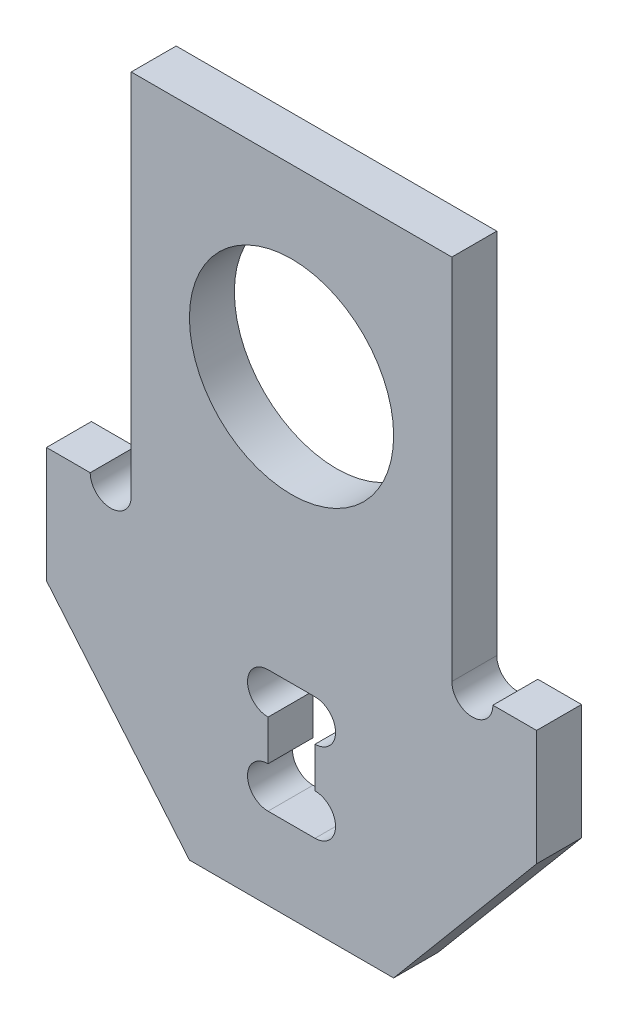
ISO-10303-21;
HEADER;
FILE_DESCRIPTION(('STEP AP214'),'2;1');
FILE_NAME('part.step','',(''),(''),'','','');
FILE_SCHEMA(('AUTOMOTIVE_DESIGN { 1 0 10303 214 1 1 1 1 }'));
ENDSEC;
DATA;
#1=APPLICATION_CONTEXT('core data for automotive mechanical design processes');
#2=APPLICATION_PROTOCOL_DEFINITION('international standard','automotive_design',2000,#1);
#3=PRODUCT_CONTEXT('',#1,'mechanical');
#4=PRODUCT('Part','Part','',(#3));
#5=PRODUCT_RELATED_PRODUCT_CATEGORY('part','',(#4));
#6=PRODUCT_DEFINITION_FORMATION('','',#4);
#7=PRODUCT_DEFINITION_CONTEXT('part definition',#1,'design');
#8=PRODUCT_DEFINITION('design','',#6,#7);
#9=PRODUCT_DEFINITION_SHAPE('','',#8);
#10=(LENGTH_UNIT() NAMED_UNIT(*) SI_UNIT(.MILLI.,.METRE.));
#11=(NAMED_UNIT(*) PLANE_ANGLE_UNIT() SI_UNIT($,.RADIAN.));
#12=(NAMED_UNIT(*) SI_UNIT($,.STERADIAN.) SOLID_ANGLE_UNIT());
#13=UNCERTAINTY_MEASURE_WITH_UNIT(LENGTH_MEASURE(1.E-05),#10,'distance_accuracy_value','');
#14=(GEOMETRIC_REPRESENTATION_CONTEXT(3) GLOBAL_UNCERTAINTY_ASSIGNED_CONTEXT((#13)) GLOBAL_UNIT_ASSIGNED_CONTEXT((#10,
#11,#12)) REPRESENTATION_CONTEXT('',''));
#15=CARTESIAN_POINT('',(0.,0.,0.));
#16=DIRECTION('',(0.,0.,1.));
#17=DIRECTION('',(1.,0.,0.));
#18=AXIS2_PLACEMENT_3D('',#15,#16,#17);
#19=CARTESIAN_POINT('',(-8.855,-9.,2.2));
#20=DIRECTION('',(0.,0.,-1.));
#21=DIRECTION('',(-1.,0.,0.));
#22=AXIS2_PLACEMENT_3D('',#19,#20,#21);
#23=CYLINDRICAL_SURFACE('',#22,1.005);
#24=CARTESIAN_POINT('',(-8.855,-9.,0.));
#25=DIRECTION('',(0.,0.,1.));
#26=DIRECTION('',(1.,0.,0.));
#27=AXIS2_PLACEMENT_3D('',#24,#25,#26);
#28=CIRCLE('',#27,1.005);
#29=CARTESIAN_POINT('',(-9.86,-9.,0.));
#30=VERTEX_POINT('',#29);
#31=CARTESIAN_POINT('',(-7.85,-9.,0.));
#32=VERTEX_POINT('',#31);
#33=EDGE_CURVE('E276',#30,#32,#28,.T.);
#34=ORIENTED_EDGE('',*,*,#33,.F.);
#35=DIRECTION('',(0.,0.,-1.));
#36=VECTOR('',#35,1.);
#37=CARTESIAN_POINT('',(-9.86,-9.,2.2));
#38=LINE('',#37,#36);
#39=CARTESIAN_POINT('',(-9.86,-9.,2.2));
#40=VERTEX_POINT('',#39);
#41=EDGE_CURVE('E11',#40,#30,#38,.T.);
#42=ORIENTED_EDGE('',*,*,#41,.F.);
#43=CARTESIAN_POINT('',(-8.855,-9.,2.2));
#44=DIRECTION('',(0.,0.,1.));
#45=DIRECTION('',(1.,0.,0.));
#46=AXIS2_PLACEMENT_3D('',#43,#44,#45);
#47=CIRCLE('',#46,1.005);
#48=CARTESIAN_POINT('',(-7.85,-9.,2.2));
#49=VERTEX_POINT('',#48);
#50=EDGE_CURVE('E326',#40,#49,#47,.T.);
#51=ORIENTED_EDGE('',*,*,#50,.T.);
#52=DIRECTION('',(0.,0.,-1.));
#53=VECTOR('',#52,1.);
#54=CARTESIAN_POINT('',(-7.85,-9.,2.2));
#55=LINE('',#54,#53);
#56=EDGE_CURVE('E55',#49,#32,#55,.T.);
#57=ORIENTED_EDGE('',*,*,#56,.T.);
#58=EDGE_LOOP('',(#34,#42,#51,#57));
#59=FACE_BOUND('',#58,.T.);
#60=ADVANCED_FACE('F36',(#59),#23,.F.);
#61=CARTESIAN_POINT('',(0.,-9.,2.2));
#62=DIRECTION('',(0.,-1.,0.));
#63=DIRECTION('',(0.,0.,-1.));
#64=AXIS2_PLACEMENT_3D('',#61,#62,#63);
#65=PLANE('',#64);
#66=DIRECTION('',(-1.,0.,0.));
#67=VECTOR('',#66,1.);
#68=CARTESIAN_POINT('',(0.,-9.,0.));
#69=LINE('',#68,#67);
#70=CARTESIAN_POINT('',(-12.,-9.,0.));
#71=VERTEX_POINT('',#70);
#72=EDGE_CURVE('E273',#30,#71,#69,.T.);
#73=ORIENTED_EDGE('',*,*,#72,.T.);
#74=DIRECTION('',(0.,0.,-1.));
#75=VECTOR('',#74,1.);
#76=CARTESIAN_POINT('',(-12.,-9.,2.2));
#77=LINE('',#76,#75);
#78=CARTESIAN_POINT('',(-12.,-9.,2.2));
#79=VERTEX_POINT('',#78);
#80=EDGE_CURVE('E46',#79,#71,#77,.T.);
#81=ORIENTED_EDGE('',*,*,#80,.F.);
#82=DIRECTION('',(-1.,0.,0.));
#83=VECTOR('',#82,1.);
#84=CARTESIAN_POINT('',(0.,-9.,2.2));
#85=LINE('',#84,#83);
#86=EDGE_CURVE('E323',#40,#79,#85,.T.);
#87=ORIENTED_EDGE('',*,*,#86,.F.);
#88=ORIENTED_EDGE('',*,*,#41,.T.);
#89=EDGE_LOOP('',(#73,#81,#87,#88));
#90=FACE_BOUND('',#89,.T.);
#91=ADVANCED_FACE('F395',(#90),#65,.F.);
#92=CARTESIAN_POINT('',(-12.,0.,2.2));
#93=DIRECTION('',(1.,0.,0.));
#94=DIRECTION('',(0.,0.,-1.));
#95=AXIS2_PLACEMENT_3D('',#92,#93,#94);
#96=PLANE('',#95);
#97=DIRECTION('',(0.,-1.,0.));
#98=VECTOR('',#97,1.);
#99=CARTESIAN_POINT('',(-12.,0.,0.));
#100=LINE('',#99,#98);
#101=CARTESIAN_POINT('',(-12.,-14.6577248518405,0.));
#102=VERTEX_POINT('',#101);
#103=EDGE_CURVE('E270',#71,#102,#100,.T.);
#104=ORIENTED_EDGE('',*,*,#103,.T.);
#105=DIRECTION('',(0.,0.,-1.));
#106=VECTOR('',#105,1.);
#107=CARTESIAN_POINT('',(-12.,-14.6577248518405,2.2));
#108=LINE('',#107,#106);
#109=CARTESIAN_POINT('',(-12.,-14.6577248518405,2.2));
#110=VERTEX_POINT('',#109);
#111=EDGE_CURVE('E220',#110,#102,#108,.T.);
#112=ORIENTED_EDGE('',*,*,#111,.F.);
#113=DIRECTION('',(0.,-1.,0.));
#114=VECTOR('',#113,1.);
#115=CARTESIAN_POINT('',(-12.,0.,2.2));
#116=LINE('',#115,#114);
#117=EDGE_CURVE('E320',#79,#110,#116,.T.);
#118=ORIENTED_EDGE('',*,*,#117,.F.);
#119=ORIENTED_EDGE('',*,*,#80,.T.);
#120=EDGE_LOOP('',(#104,#112,#118,#119));
#121=FACE_BOUND('',#120,.T.);
#122=ADVANCED_FACE('F400',(#121),#96,.F.);
#123=CARTESIAN_POINT('',(-14.2594096038077,-11.9650653393608,2.2));
#124=DIRECTION('',(0.766044443118979,0.642787609686538,0.));
#125=DIRECTION('',(-0.642787609686538,0.766044443118979,0.));
#126=AXIS2_PLACEMENT_3D('',#123,#124,#125);
#127=PLANE('',#126);
#128=DIRECTION('',(0.642787609686538,-0.766044443118979,0.));
#129=VECTOR('',#128,1.);
#130=CARTESIAN_POINT('',(-14.2594096038077,-11.9650653393608,0.));
#131=LINE('',#130,#129);
#132=CARTESIAN_POINT('',(-4.99999999999999,-23.,0.));
#133=VERTEX_POINT('',#132);
#134=EDGE_CURVE('E267',#102,#133,#131,.T.);
#135=ORIENTED_EDGE('',*,*,#134,.T.);
#136=DIRECTION('',(0.,0.,-1.));
#137=VECTOR('',#136,1.);
#138=CARTESIAN_POINT('',(-4.99999999999999,-23.,2.2));
#139=LINE('',#138,#137);
#140=CARTESIAN_POINT('',(-4.99999999999999,-23.,2.2));
#141=VERTEX_POINT('',#140);
#142=EDGE_CURVE('E217',#141,#133,#139,.T.);
#143=ORIENTED_EDGE('',*,*,#142,.F.);
#144=DIRECTION('',(0.642787609686538,-0.766044443118979,0.));
#145=VECTOR('',#144,1.);
#146=CARTESIAN_POINT('',(-14.2594096038077,-11.9650653393608,2.2));
#147=LINE('',#146,#145);
#148=EDGE_CURVE('E317',#110,#141,#147,.T.);
#149=ORIENTED_EDGE('',*,*,#148,.F.);
#150=ORIENTED_EDGE('',*,*,#111,.T.);
#151=EDGE_LOOP('',(#135,#143,#149,#150));
#152=FACE_BOUND('',#151,.T.);
#153=ADVANCED_FACE('F544',(#152),#127,.F.);
#154=CARTESIAN_POINT('',(0.,-23.,2.2));
#155=DIRECTION('',(0.,1.,0.));
#156=DIRECTION('',(0.,0.,1.));
#157=AXIS2_PLACEMENT_3D('',#154,#155,#156);
#158=PLANE('',#157);
#159=DIRECTION('',(1.,0.,0.));
#160=VECTOR('',#159,1.);
#161=CARTESIAN_POINT('',(0.,-23.,0.));
#162=LINE('',#161,#160);
#163=CARTESIAN_POINT('',(5.,-23.,0.));
#164=VERTEX_POINT('',#163);
#165=EDGE_CURVE('E264',#133,#164,#162,.T.);
#166=ORIENTED_EDGE('',*,*,#165,.T.);
#167=DIRECTION('',(0.,0.,-1.));
#168=VECTOR('',#167,1.);
#169=CARTESIAN_POINT('',(5.,-23.,2.2));
#170=LINE('',#169,#168);
#171=CARTESIAN_POINT('',(5.,-23.,2.2));
#172=VERTEX_POINT('',#171);
#173=EDGE_CURVE('E215',#172,#164,#170,.T.);
#174=ORIENTED_EDGE('',*,*,#173,.F.);
#175=DIRECTION('',(1.,0.,0.));
#176=VECTOR('',#175,1.);
#177=CARTESIAN_POINT('',(0.,-23.,2.2));
#178=LINE('',#177,#176);
#179=EDGE_CURVE('E315',#141,#172,#178,.T.);
#180=ORIENTED_EDGE('',*,*,#179,.F.);
#181=ORIENTED_EDGE('',*,*,#142,.T.);
#182=EDGE_LOOP('',(#166,#174,#180,#181));
#183=FACE_BOUND('',#182,.T.);
#184=ADVANCED_FACE('F535',(#183),#158,.F.);
#185=CARTESIAN_POINT('',(14.2594096038077,-11.9650653393608,2.2));
#186=DIRECTION('',(0.766044443118979,-0.642787609686538,0.));
#187=DIRECTION('',(0.642787609686538,0.766044443118979,0.));
#188=AXIS2_PLACEMENT_3D('',#185,#186,#187);
#189=PLANE('',#188);
#190=DIRECTION('',(-0.642787609686538,-0.766044443118979,0.));
#191=VECTOR('',#190,1.);
#192=CARTESIAN_POINT('',(14.2594096038077,-11.9650653393608,0.));
#193=LINE('',#192,#191);
#194=CARTESIAN_POINT('',(12.,-14.6577248518405,0.));
#195=VERTEX_POINT('',#194);
#196=EDGE_CURVE('E261',#195,#164,#193,.T.);
#197=ORIENTED_EDGE('',*,*,#196,.F.);
#198=DIRECTION('',(0.,0.,-1.));
#199=VECTOR('',#198,1.);
#200=CARTESIAN_POINT('',(12.,-14.6577248518405,2.2));
#201=LINE('',#200,#199);
#202=CARTESIAN_POINT('',(12.,-14.6577248518405,2.2));
#203=VERTEX_POINT('',#202);
#204=EDGE_CURVE('E213',#203,#195,#201,.T.);
#205=ORIENTED_EDGE('',*,*,#204,.F.);
#206=DIRECTION('',(-0.642787609686538,-0.766044443118979,0.));
#207=VECTOR('',#206,1.);
#208=CARTESIAN_POINT('',(14.2594096038077,-11.9650653393608,2.2));
#209=LINE('',#208,#207);
#210=EDGE_CURVE('E312',#203,#172,#209,.T.);
#211=ORIENTED_EDGE('',*,*,#210,.T.);
#212=ORIENTED_EDGE('',*,*,#173,.T.);
#213=EDGE_LOOP('',(#197,#205,#211,#212));
#214=FACE_BOUND('',#213,.T.);
#215=ADVANCED_FACE('F526',(#214),#189,.T.);
#216=CARTESIAN_POINT('',(12.,0.,2.2));
#217=DIRECTION('',(1.,0.,0.));
#218=DIRECTION('',(0.,0.,-1.));
#219=AXIS2_PLACEMENT_3D('',#216,#217,#218);
#220=PLANE('',#219);
#221=DIRECTION('',(0.,-1.,0.));
#222=VECTOR('',#221,1.);
#223=CARTESIAN_POINT('',(12.,0.,0.));
#224=LINE('',#223,#222);
#225=CARTESIAN_POINT('',(12.,-9.,0.));
#226=VERTEX_POINT('',#225);
#227=EDGE_CURVE('E258',#226,#195,#224,.T.);
#228=ORIENTED_EDGE('',*,*,#227,.F.);
#229=DIRECTION('',(0.,0.,-1.));
#230=VECTOR('',#229,1.);
#231=CARTESIAN_POINT('',(12.,-9.,2.2));
#232=LINE('',#231,#230);
#233=CARTESIAN_POINT('',(12.,-9.,2.2));
#234=VERTEX_POINT('',#233);
#235=EDGE_CURVE('E211',#234,#226,#232,.T.);
#236=ORIENTED_EDGE('',*,*,#235,.F.);
#237=DIRECTION('',(0.,-1.,0.));
#238=VECTOR('',#237,1.);
#239=CARTESIAN_POINT('',(12.,0.,2.2));
#240=LINE('',#239,#238);
#241=EDGE_CURVE('E309',#234,#203,#240,.T.);
#242=ORIENTED_EDGE('',*,*,#241,.T.);
#243=ORIENTED_EDGE('',*,*,#204,.T.);
#244=EDGE_LOOP('',(#228,#236,#242,#243));
#245=FACE_BOUND('',#244,.T.);
#246=ADVANCED_FACE('F517',(#245),#220,.T.);
#247=CARTESIAN_POINT('',(0.,-9.,2.2));
#248=DIRECTION('',(0.,1.,0.));
#249=DIRECTION('',(-1.,0.,0.));
#250=AXIS2_PLACEMENT_3D('',#247,#248,#249);
#251=PLANE('',#250);
#252=DIRECTION('',(1.,0.,0.));
#253=VECTOR('',#252,1.);
#254=CARTESIAN_POINT('',(0.,-9.,0.));
#255=LINE('',#254,#253);
#256=CARTESIAN_POINT('',(9.86,-9.,0.));
#257=VERTEX_POINT('',#256);
#258=EDGE_CURVE('E255',#257,#226,#255,.T.);
#259=ORIENTED_EDGE('',*,*,#258,.F.);
#260=DIRECTION('',(0.,0.,-1.));
#261=VECTOR('',#260,1.);
#262=CARTESIAN_POINT('',(9.86,-9.,2.2));
#263=LINE('',#262,#261);
#264=CARTESIAN_POINT('',(9.86,-9.,2.2));
#265=VERTEX_POINT('',#264);
#266=EDGE_CURVE('E205',#265,#257,#263,.T.);
#267=ORIENTED_EDGE('',*,*,#266,.F.);
#268=DIRECTION('',(1.,0.,0.));
#269=VECTOR('',#268,1.);
#270=CARTESIAN_POINT('',(0.,-9.,2.2));
#271=LINE('',#270,#269);
#272=EDGE_CURVE('E306',#265,#234,#271,.T.);
#273=ORIENTED_EDGE('',*,*,#272,.T.);
#274=ORIENTED_EDGE('',*,*,#235,.T.);
#275=EDGE_LOOP('',(#259,#267,#273,#274));
#276=FACE_BOUND('',#275,.T.);
#277=ADVANCED_FACE('F508',(#276),#251,.T.);
#278=CARTESIAN_POINT('',(8.85500000000001,-9.,2.2));
#279=DIRECTION('',(0.,0.,-1.));
#280=DIRECTION('',(-1.,0.,0.));
#281=AXIS2_PLACEMENT_3D('',#278,#279,#280);
#282=CYLINDRICAL_SURFACE('',#281,1.005);
#283=CARTESIAN_POINT('',(8.85500000000001,-9.,0.));
#284=DIRECTION('',(0.,0.,1.));
#285=DIRECTION('',(1.,0.,0.));
#286=AXIS2_PLACEMENT_3D('',#283,#284,#285);
#287=CIRCLE('',#286,1.005);
#288=CARTESIAN_POINT('',(7.85,-9.,0.));
#289=VERTEX_POINT('',#288);
#290=EDGE_CURVE('E252',#289,#257,#287,.T.);
#291=ORIENTED_EDGE('',*,*,#290,.F.);
#292=DIRECTION('',(0.,0.,-1.));
#293=VECTOR('',#292,1.);
#294=CARTESIAN_POINT('',(7.85,-9.,2.2));
#295=LINE('',#294,#293);
#296=CARTESIAN_POINT('',(7.85,-9.,2.2));
#297=VERTEX_POINT('',#296);
#298=EDGE_CURVE('E203',#297,#289,#295,.T.);
#299=ORIENTED_EDGE('',*,*,#298,.F.);
#300=CARTESIAN_POINT('',(8.85500000000001,-9.,2.2));
#301=DIRECTION('',(0.,0.,1.));
#302=DIRECTION('',(1.,0.,0.));
#303=AXIS2_PLACEMENT_3D('',#300,#301,#302);
#304=CIRCLE('',#303,1.005);
#305=EDGE_CURVE('E197',#297,#265,#304,.T.);
#306=ORIENTED_EDGE('',*,*,#305,.T.);
#307=ORIENTED_EDGE('',*,*,#266,.T.);
#308=EDGE_LOOP('',(#291,#299,#306,#307));
#309=FACE_BOUND('',#308,.T.);
#310=ADVANCED_FACE('F500',(#309),#282,.F.);
#311=CARTESIAN_POINT('',(7.85,0.,2.2));
#312=DIRECTION('',(-1.,0.,0.));
#313=DIRECTION('',(0.,-1.,0.));
#314=AXIS2_PLACEMENT_3D('',#311,#312,#313);
#315=PLANE('',#314);
#316=DIRECTION('',(0.,1.,0.));
#317=VECTOR('',#316,1.);
#318=CARTESIAN_POINT('',(7.85,0.,0.));
#319=LINE('',#318,#317);
#320=CARTESIAN_POINT('',(7.85,9.,0.));
#321=VERTEX_POINT('',#320);
#322=EDGE_CURVE('E202',#289,#321,#319,.T.);
#323=ORIENTED_EDGE('',*,*,#322,.T.);
#324=DIRECTION('',(0.,0.,-1.));
#325=VECTOR('',#324,1.);
#326=CARTESIAN_POINT('',(7.85,9.,2.2));
#327=LINE('',#326,#325);
#328=CARTESIAN_POINT('',(7.85,9.,2.2));
#329=VERTEX_POINT('',#328);
#330=EDGE_CURVE('E184',#329,#321,#327,.T.);
#331=ORIENTED_EDGE('',*,*,#330,.F.);
#332=DIRECTION('',(0.,1.,0.));
#333=VECTOR('',#332,1.);
#334=CARTESIAN_POINT('',(7.85,0.,2.2));
#335=LINE('',#334,#333);
#336=EDGE_CURVE('E189',#297,#329,#335,.T.);
#337=ORIENTED_EDGE('',*,*,#336,.F.);
#338=ORIENTED_EDGE('',*,*,#298,.T.);
#339=EDGE_LOOP('',(#323,#331,#337,#338));
#340=FACE_BOUND('',#339,.T.);
#341=ADVANCED_FACE('F200',(#340),#315,.F.);
#342=CARTESIAN_POINT('',(0.,9.,2.2));
#343=DIRECTION('',(0.,-1.,0.));
#344=DIRECTION('',(1.,0.,0.));
#345=AXIS2_PLACEMENT_3D('',#342,#343,#344);
#346=PLANE('',#345);
#347=DIRECTION('',(-1.,0.,0.));
#348=VECTOR('',#347,1.);
#349=CARTESIAN_POINT('',(0.,9.,0.));
#350=LINE('',#349,#348);
#351=CARTESIAN_POINT('',(-7.85,9.,0.));
#352=VERTEX_POINT('',#351);
#353=EDGE_CURVE('E249',#321,#352,#350,.T.);
#354=ORIENTED_EDGE('',*,*,#353,.T.);
#355=DIRECTION('',(0.,0.,-1.));
#356=VECTOR('',#355,1.);
#357=CARTESIAN_POINT('',(-7.85,9.,2.2));
#358=LINE('',#357,#356);
#359=CARTESIAN_POINT('',(-7.85,9.,2.2));
#360=VERTEX_POINT('',#359);
#361=EDGE_CURVE('E117',#360,#352,#358,.T.);
#362=ORIENTED_EDGE('',*,*,#361,.F.);
#363=DIRECTION('',(-1.,0.,0.));
#364=VECTOR('',#363,1.);
#365=CARTESIAN_POINT('',(0.,9.,2.2));
#366=LINE('',#365,#364);
#367=EDGE_CURVE('E180',#329,#360,#366,.T.);
#368=ORIENTED_EDGE('',*,*,#367,.F.);
#369=ORIENTED_EDGE('',*,*,#330,.T.);
#370=EDGE_LOOP('',(#354,#362,#368,#369));
#371=FACE_BOUND('',#370,.T.);
#372=ADVANCED_FACE('F182',(#371),#346,.F.);
#373=CARTESIAN_POINT('',(1.15,-17.995,2.2));
#374=DIRECTION('',(0.,0.,-1.));
#375=DIRECTION('',(-1.,0.,0.));
#376=AXIS2_PLACEMENT_3D('',#373,#374,#375);
#377=CYLINDRICAL_SURFACE('',#376,1.005);
#378=CARTESIAN_POINT('',(1.15,-17.995,0.));
#379=DIRECTION('',(0.,0.,1.));
#380=DIRECTION('',(1.,0.,0.));
#381=AXIS2_PLACEMENT_3D('',#378,#379,#380);
#382=CIRCLE('',#381,1.005);
#383=CARTESIAN_POINT('',(1.15,-19.,0.));
#384=VERTEX_POINT('',#383);
#385=CARTESIAN_POINT('',(1.15,-16.99,0.));
#386=VERTEX_POINT('',#385);
#387=EDGE_CURVE('E298',#384,#386,#382,.T.);
#388=ORIENTED_EDGE('',*,*,#387,.F.);
#389=DIRECTION('',(0.,0.,-1.));
#390=VECTOR('',#389,1.);
#391=CARTESIAN_POINT('',(1.15,-19.,2.2));
#392=LINE('',#391,#390);
#393=CARTESIAN_POINT('',(1.15,-19.,2.2));
#394=VERTEX_POINT('',#393);
#395=EDGE_CURVE('E40',#394,#384,#392,.T.);
#396=ORIENTED_EDGE('',*,*,#395,.F.);
#397=CARTESIAN_POINT('',(1.15,-17.995,2.2));
#398=DIRECTION('',(0.,0.,1.));
#399=DIRECTION('',(1.,0.,0.));
#400=AXIS2_PLACEMENT_3D('',#397,#398,#399);
#401=CIRCLE('',#400,1.005);
#402=CARTESIAN_POINT('',(1.15,-16.99,2.2));
#403=VERTEX_POINT('',#402);
#404=EDGE_CURVE('E346',#394,#403,#401,.T.);
#405=ORIENTED_EDGE('',*,*,#404,.T.);
#406=DIRECTION('',(0.,0.,-1.));
#407=VECTOR('',#406,1.);
#408=CARTESIAN_POINT('',(1.15,-16.99,2.2));
#409=LINE('',#408,#407);
#410=EDGE_CURVE('E225',#403,#386,#409,.T.);
#411=ORIENTED_EDGE('',*,*,#410,.T.);
#412=EDGE_LOOP('',(#388,#396,#405,#411));
#413=FACE_BOUND('',#412,.T.);
#414=ADVANCED_FACE('F362',(#413),#377,.F.);
#415=CARTESIAN_POINT('',(0.,-19.,2.2));
#416=DIRECTION('',(0.,-1.,0.));
#417=DIRECTION('',(0.,0.,-1.));
#418=AXIS2_PLACEMENT_3D('',#415,#416,#417);
#419=PLANE('',#418);
#420=DIRECTION('',(-1.,0.,0.));
#421=VECTOR('',#420,1.);
#422=CARTESIAN_POINT('',(0.,-19.,0.));
#423=LINE('',#422,#421);
#424=CARTESIAN_POINT('',(-1.15,-19.,0.));
#425=VERTEX_POINT('',#424);
#426=EDGE_CURVE('E296',#384,#425,#423,.T.);
#427=ORIENTED_EDGE('',*,*,#426,.T.);
#428=DIRECTION('',(0.,0.,-1.));
#429=VECTOR('',#428,1.);
#430=CARTESIAN_POINT('',(-1.15,-19.,2.2));
#431=LINE('',#430,#429);
#432=CARTESIAN_POINT('',(-1.15,-19.,2.2));
#433=VERTEX_POINT('',#432);
#434=EDGE_CURVE('E236',#433,#425,#431,.T.);
#435=ORIENTED_EDGE('',*,*,#434,.F.);
#436=DIRECTION('',(-1.,0.,0.));
#437=VECTOR('',#436,1.);
#438=CARTESIAN_POINT('',(0.,-19.,2.2));
#439=LINE('',#438,#437);
#440=EDGE_CURVE('E344',#394,#433,#439,.T.);
#441=ORIENTED_EDGE('',*,*,#440,.F.);
#442=ORIENTED_EDGE('',*,*,#395,.T.);
#443=EDGE_LOOP('',(#427,#435,#441,#442));
#444=FACE_BOUND('',#443,.T.);
#445=ADVANCED_FACE('F386',(#444),#419,.F.);
#446=CARTESIAN_POINT('',(-1.15,-17.995,2.2));
#447=DIRECTION('',(0.,0.,-1.));
#448=DIRECTION('',(-1.,0.,0.));
#449=AXIS2_PLACEMENT_3D('',#446,#447,#448);
#450=CYLINDRICAL_SURFACE('',#449,1.005);
#451=CARTESIAN_POINT('',(-1.15,-17.995,0.));
#452=DIRECTION('',(0.,0.,1.));
#453=DIRECTION('',(1.,0.,0.));
#454=AXIS2_PLACEMENT_3D('',#451,#452,#453);
#455=CIRCLE('',#454,1.005);
#456=CARTESIAN_POINT('',(-1.15,-16.99,0.));
#457=VERTEX_POINT('',#456);
#458=EDGE_CURVE('E293',#457,#425,#455,.T.);
#459=ORIENTED_EDGE('',*,*,#458,.F.);
#460=DIRECTION('',(0.,0.,-1.));
#461=VECTOR('',#460,1.);
#462=CARTESIAN_POINT('',(-1.15,-16.99,2.2));
#463=LINE('',#462,#461);
#464=CARTESIAN_POINT('',(-1.15,-16.99,2.2));
#465=VERTEX_POINT('',#464);
#466=EDGE_CURVE('E235',#465,#457,#463,.T.);
#467=ORIENTED_EDGE('',*,*,#466,.F.);
#468=CARTESIAN_POINT('',(-1.15,-17.995,2.2));
#469=DIRECTION('',(0.,0.,1.));
#470=DIRECTION('',(1.,0.,0.));
#471=AXIS2_PLACEMENT_3D('',#468,#469,#470);
#472=CIRCLE('',#471,1.005);
#473=EDGE_CURVE('E342',#465,#433,#472,.T.);
#474=ORIENTED_EDGE('',*,*,#473,.T.);
#475=ORIENTED_EDGE('',*,*,#434,.T.);
#476=EDGE_LOOP('',(#459,#467,#474,#475));
#477=FACE_BOUND('',#476,.T.);
#478=ADVANCED_FACE('F384',(#477),#450,.F.);
#479=CARTESIAN_POINT('',(-1.15,0.,2.2));
#480=DIRECTION('',(-1.,0.,0.));
#481=DIRECTION('',(0.,-1.,0.));
#482=AXIS2_PLACEMENT_3D('',#479,#480,#481);
#483=PLANE('',#482);
#484=DIRECTION('',(0.,1.,0.));
#485=VECTOR('',#484,1.);
#486=CARTESIAN_POINT('',(-1.15,0.,0.));
#487=LINE('',#486,#485);
#488=CARTESIAN_POINT('',(-1.15,-15.01,0.));
#489=VERTEX_POINT('',#488);
#490=EDGE_CURVE('E290',#457,#489,#487,.T.);
#491=ORIENTED_EDGE('',*,*,#490,.T.);
#492=DIRECTION('',(0.,0.,-1.));
#493=VECTOR('',#492,1.);
#494=CARTESIAN_POINT('',(-1.15,-15.01,2.2));
#495=LINE('',#494,#493);
#496=CARTESIAN_POINT('',(-1.15,-15.01,2.2));
#497=VERTEX_POINT('',#496);
#498=EDGE_CURVE('E233',#497,#489,#495,.T.);
#499=ORIENTED_EDGE('',*,*,#498,.F.);
#500=DIRECTION('',(0.,1.,0.));
#501=VECTOR('',#500,1.);
#502=CARTESIAN_POINT('',(-1.15,0.,2.2));
#503=LINE('',#502,#501);
#504=EDGE_CURVE('E340',#465,#497,#503,.T.);
#505=ORIENTED_EDGE('',*,*,#504,.F.);
#506=ORIENTED_EDGE('',*,*,#466,.T.);
#507=EDGE_LOOP('',(#491,#499,#505,#506));
#508=FACE_BOUND('',#507,.T.);
#509=ADVANCED_FACE('F383',(#508),#483,.F.);
#510=CARTESIAN_POINT('',(-1.15,-14.005,2.2));
#511=DIRECTION('',(0.,0.,-1.));
#512=DIRECTION('',(-1.,0.,0.));
#513=AXIS2_PLACEMENT_3D('',#510,#511,#512);
#514=CYLINDRICAL_SURFACE('',#513,1.005);
#515=CARTESIAN_POINT('',(-1.15,-14.005,0.));
#516=DIRECTION('',(0.,0.,1.));
#517=DIRECTION('',(1.,0.,0.));
#518=AXIS2_PLACEMENT_3D('',#515,#516,#517);
#519=CIRCLE('',#518,1.005);
#520=CARTESIAN_POINT('',(-1.15,-13.,0.));
#521=VERTEX_POINT('',#520);
#522=EDGE_CURVE('E287',#521,#489,#519,.T.);
#523=ORIENTED_EDGE('',*,*,#522,.F.);
#524=DIRECTION('',(0.,0.,-1.));
#525=VECTOR('',#524,1.);
#526=CARTESIAN_POINT('',(-1.15,-13.,2.2));
#527=LINE('',#526,#525);
#528=CARTESIAN_POINT('',(-1.15,-13.,2.2));
#529=VERTEX_POINT('',#528);
#530=EDGE_CURVE('E231',#529,#521,#527,.T.);
#531=ORIENTED_EDGE('',*,*,#530,.F.);
#532=CARTESIAN_POINT('',(-1.15,-14.005,2.2));
#533=DIRECTION('',(0.,0.,1.));
#534=DIRECTION('',(1.,0.,0.));
#535=AXIS2_PLACEMENT_3D('',#532,#533,#534);
#536=CIRCLE('',#535,1.005);
#537=EDGE_CURVE('E337',#529,#497,#536,.T.);
#538=ORIENTED_EDGE('',*,*,#537,.T.);
#539=ORIENTED_EDGE('',*,*,#498,.T.);
#540=EDGE_LOOP('',(#523,#531,#538,#539));
#541=FACE_BOUND('',#540,.T.);
#542=ADVANCED_FACE('F379',(#541),#514,.F.);
#543=CARTESIAN_POINT('',(0.,-13.,2.2));
#544=DIRECTION('',(0.,-1.,0.));
#545=DIRECTION('',(1.,0.,0.));
#546=AXIS2_PLACEMENT_3D('',#543,#544,#545);
#547=PLANE('',#546);
#548=DIRECTION('',(-1.,0.,0.));
#549=VECTOR('',#548,1.);
#550=CARTESIAN_POINT('',(0.,-13.,0.));
#551=LINE('',#550,#549);
#552=CARTESIAN_POINT('',(1.15,-13.,0.));
#553=VERTEX_POINT('',#552);
#554=EDGE_CURVE('E284',#553,#521,#551,.T.);
#555=ORIENTED_EDGE('',*,*,#554,.F.);
#556=DIRECTION('',(0.,0.,-1.));
#557=VECTOR('',#556,1.);
#558=CARTESIAN_POINT('',(1.15,-13.,2.2));
#559=LINE('',#558,#557);
#560=CARTESIAN_POINT('',(1.15,-13.,2.2));
#561=VERTEX_POINT('',#560);
#562=EDGE_CURVE('E229',#561,#553,#559,.T.);
#563=ORIENTED_EDGE('',*,*,#562,.F.);
#564=DIRECTION('',(-1.,0.,0.));
#565=VECTOR('',#564,1.);
#566=CARTESIAN_POINT('',(0.,-13.,2.2));
#567=LINE('',#566,#565);
#568=EDGE_CURVE('E334',#561,#529,#567,.T.);
#569=ORIENTED_EDGE('',*,*,#568,.T.);
#570=ORIENTED_EDGE('',*,*,#530,.T.);
#571=EDGE_LOOP('',(#555,#563,#569,#570));
#572=FACE_BOUND('',#571,.T.);
#573=ADVANCED_FACE('F375',(#572),#547,.T.);
#574=CARTESIAN_POINT('',(1.15,-14.005,2.2));
#575=DIRECTION('',(0.,0.,-1.));
#576=DIRECTION('',(-1.,0.,0.));
#577=AXIS2_PLACEMENT_3D('',#574,#575,#576);
#578=CYLINDRICAL_SURFACE('',#577,1.005);
#579=CARTESIAN_POINT('',(1.15,-14.005,0.));
#580=DIRECTION('',(0.,0.,1.));
#581=DIRECTION('',(1.,0.,0.));
#582=AXIS2_PLACEMENT_3D('',#579,#580,#581);
#583=CIRCLE('',#582,1.005);
#584=CARTESIAN_POINT('',(1.15,-15.01,0.));
#585=VERTEX_POINT('',#584);
#586=EDGE_CURVE('E281',#585,#553,#583,.T.);
#587=ORIENTED_EDGE('',*,*,#586,.F.);
#588=DIRECTION('',(0.,0.,-1.));
#589=VECTOR('',#588,1.);
#590=CARTESIAN_POINT('',(1.15,-15.01,2.2));
#591=LINE('',#590,#589);
#592=CARTESIAN_POINT('',(1.15,-15.01,2.2));
#593=VERTEX_POINT('',#592);
#594=EDGE_CURVE('E227',#593,#585,#591,.T.);
#595=ORIENTED_EDGE('',*,*,#594,.F.);
#596=CARTESIAN_POINT('',(1.15,-14.005,2.2));
#597=DIRECTION('',(0.,0.,1.));
#598=DIRECTION('',(1.,0.,0.));
#599=AXIS2_PLACEMENT_3D('',#596,#597,#598);
#600=CIRCLE('',#599,1.005);
#601=EDGE_CURVE('E331',#593,#561,#600,.T.);
#602=ORIENTED_EDGE('',*,*,#601,.T.);
#603=ORIENTED_EDGE('',*,*,#562,.T.);
#604=EDGE_LOOP('',(#587,#595,#602,#603));
#605=FACE_BOUND('',#604,.T.);
#606=ADVANCED_FACE('F370',(#605),#578,.F.);
#607=CARTESIAN_POINT('',(1.15,0.,2.2));
#608=DIRECTION('',(-1.,0.,0.));
#609=DIRECTION('',(0.,-1.,0.));
#610=AXIS2_PLACEMENT_3D('',#607,#608,#609);
#611=PLANE('',#610);
#612=DIRECTION('',(0.,1.,0.));
#613=VECTOR('',#612,1.);
#614=CARTESIAN_POINT('',(1.15,0.,0.));
#615=LINE('',#614,#613);
#616=EDGE_CURVE('E278',#386,#585,#615,.T.);
#617=ORIENTED_EDGE('',*,*,#616,.F.);
#618=ORIENTED_EDGE('',*,*,#410,.F.);
#619=DIRECTION('',(0.,1.,0.));
#620=VECTOR('',#619,1.);
#621=CARTESIAN_POINT('',(1.15,0.,2.2));
#622=LINE('',#621,#620);
#623=EDGE_CURVE('E328',#403,#593,#622,.T.);
#624=ORIENTED_EDGE('',*,*,#623,.T.);
#625=ORIENTED_EDGE('',*,*,#594,.T.);
#626=EDGE_LOOP('',(#617,#618,#624,#625));
#627=FACE_BOUND('',#626,.T.);
#628=ADVANCED_FACE('F367',(#627),#611,.T.);
#629=CARTESIAN_POINT('',(0.,0.,2.2));
#630=DIRECTION('',(0.,0.,-1.));
#631=DIRECTION('',(-1.,0.,0.));
#632=AXIS2_PLACEMENT_3D('',#629,#630,#631);
#633=CYLINDRICAL_SURFACE('',#632,5.);
#634=CARTESIAN_POINT('',(0.,0.,2.2));
#635=DIRECTION('',(0.,0.,1.));
#636=DIRECTION('',(1.,0.,0.));
#637=AXIS2_PLACEMENT_3D('',#634,#635,#636);
#638=CIRCLE('',#637,5.);
#639=CARTESIAN_POINT('',(5.,0.,2.2));
#640=VERTEX_POINT('',#639);
#641=EDGE_CURVE('E248',#640,#640,#638,.T.);
#642=ORIENTED_EDGE('',*,*,#641,.T.);
#643=EDGE_LOOP('',(#642));
#644=FACE_BOUND('',#643,.T.);
#645=CARTESIAN_POINT('',(0.,0.,0.));
#646=DIRECTION('',(0.,0.,1.));
#647=DIRECTION('',(1.,0.,0.));
#648=AXIS2_PLACEMENT_3D('',#645,#646,#647);
#649=CIRCLE('',#648,5.);
#650=CARTESIAN_POINT('',(5.,0.,0.));
#651=VERTEX_POINT('',#650);
#652=EDGE_CURVE('E301',#651,#651,#649,.T.);
#653=ORIENTED_EDGE('',*,*,#652,.F.);
#654=EDGE_LOOP('',(#653));
#655=FACE_BOUND('',#654,.T.);
#656=ADVANCED_FACE('F38',(#644,#655),#633,.F.);
#657=CARTESIAN_POINT('',(-7.85,0.,2.2));
#658=DIRECTION('',(-1.,0.,0.));
#659=DIRECTION('',(0.,-1.,0.));
#660=AXIS2_PLACEMENT_3D('',#657,#658,#659);
#661=PLANE('',#660);
#662=DIRECTION('',(0.,1.,0.));
#663=VECTOR('',#662,1.);
#664=CARTESIAN_POINT('',(-7.85,0.,0.));
#665=LINE('',#664,#663);
#666=EDGE_CURVE('E245',#32,#352,#665,.T.);
#667=ORIENTED_EDGE('',*,*,#666,.F.);
#668=ORIENTED_EDGE('',*,*,#56,.F.);
#669=DIRECTION('',(0.,1.,0.));
#670=VECTOR('',#669,1.);
#671=CARTESIAN_POINT('',(-7.85,0.,2.2));
#672=LINE('',#671,#670);
#673=EDGE_CURVE('E188',#49,#360,#672,.T.);
#674=ORIENTED_EDGE('',*,*,#673,.T.);
#675=ORIENTED_EDGE('',*,*,#361,.T.);
#676=EDGE_LOOP('',(#667,#668,#674,#675));
#677=FACE_BOUND('',#676,.T.);
#678=ADVANCED_FACE('F356',(#677),#661,.T.);
#679=CARTESIAN_POINT('',(0.,0.,2.2));
#680=DIRECTION('',(0.,0.,1.));
#681=DIRECTION('',(1.,0.,0.));
#682=AXIS2_PLACEMENT_3D('',#679,#680,#681);
#683=PLANE('',#682);
#684=ORIENTED_EDGE('',*,*,#641,.F.);
#685=EDGE_LOOP('',(#684));
#686=FACE_BOUND('',#685,.T.);
#687=ORIENTED_EDGE('',*,*,#404,.F.);
#688=ORIENTED_EDGE('',*,*,#440,.T.);
#689=ORIENTED_EDGE('',*,*,#473,.F.);
#690=ORIENTED_EDGE('',*,*,#504,.T.);
#691=ORIENTED_EDGE('',*,*,#537,.F.);
#692=ORIENTED_EDGE('',*,*,#568,.F.);
#693=ORIENTED_EDGE('',*,*,#601,.F.);
#694=ORIENTED_EDGE('',*,*,#623,.F.);
#695=EDGE_LOOP('',(#687,#688,#689,#690,#691,#692,#693,#694));
#696=FACE_BOUND('',#695,.T.);
#697=ORIENTED_EDGE('',*,*,#50,.F.);
#698=ORIENTED_EDGE('',*,*,#86,.T.);
#699=ORIENTED_EDGE('',*,*,#117,.T.);
#700=ORIENTED_EDGE('',*,*,#148,.T.);
#701=ORIENTED_EDGE('',*,*,#179,.T.);
#702=ORIENTED_EDGE('',*,*,#210,.F.);
#703=ORIENTED_EDGE('',*,*,#241,.F.);
#704=ORIENTED_EDGE('',*,*,#272,.F.);
#705=ORIENTED_EDGE('',*,*,#305,.F.);
#706=ORIENTED_EDGE('',*,*,#336,.T.);
#707=ORIENTED_EDGE('',*,*,#367,.T.);
#708=ORIENTED_EDGE('',*,*,#673,.F.);
#709=EDGE_LOOP('',(#697,#698,#699,#700,#701,#702,#703,#704,#705,#706,#707,#708));
#710=FACE_BOUND('',#709,.T.);
#711=ADVANCED_FACE('F194',(#686,#696,#710),#683,.T.);
#712=CARTESIAN_POINT('',(0.,0.,0.));
#713=DIRECTION('',(0.,0.,1.));
#714=DIRECTION('',(1.,0.,0.));
#715=AXIS2_PLACEMENT_3D('',#712,#713,#714);
#716=PLANE('',#715);
#717=ORIENTED_EDGE('',*,*,#652,.T.);
#718=EDGE_LOOP('',(#717));
#719=FACE_BOUND('',#718,.T.);
#720=ORIENTED_EDGE('',*,*,#387,.T.);
#721=ORIENTED_EDGE('',*,*,#616,.T.);
#722=ORIENTED_EDGE('',*,*,#586,.T.);
#723=ORIENTED_EDGE('',*,*,#554,.T.);
#724=ORIENTED_EDGE('',*,*,#522,.T.);
#725=ORIENTED_EDGE('',*,*,#490,.F.);
#726=ORIENTED_EDGE('',*,*,#458,.T.);
#727=ORIENTED_EDGE('',*,*,#426,.F.);
#728=EDGE_LOOP('',(#720,#721,#722,#723,#724,#725,#726,#727));
#729=FACE_BOUND('',#728,.T.);
#730=ORIENTED_EDGE('',*,*,#33,.T.);
#731=ORIENTED_EDGE('',*,*,#666,.T.);
#732=ORIENTED_EDGE('',*,*,#353,.F.);
#733=ORIENTED_EDGE('',*,*,#322,.F.);
#734=ORIENTED_EDGE('',*,*,#290,.T.);
#735=ORIENTED_EDGE('',*,*,#258,.T.);
#736=ORIENTED_EDGE('',*,*,#227,.T.);
#737=ORIENTED_EDGE('',*,*,#196,.T.);
#738=ORIENTED_EDGE('',*,*,#165,.F.);
#739=ORIENTED_EDGE('',*,*,#134,.F.);
#740=ORIENTED_EDGE('',*,*,#103,.F.);
#741=ORIENTED_EDGE('',*,*,#72,.F.);
#742=EDGE_LOOP('',(#730,#731,#732,#733,#734,#735,#736,#737,#738,#739,#740,#741));
#743=FACE_BOUND('',#742,.T.);
#744=ADVANCED_FACE('F355',(#719,#729,#743),#716,.F.);
#745=CLOSED_SHELL('',(#60,#91,#122,#153,#184,#215,#246,#277,#310,#341,#372,#414,#445,#478,#509,
#542,#573,#606,#628,#656,#678,#711,#744));
#746=MANIFOLD_SOLID_BREP('B2',#745);
#747=ADVANCED_BREP_SHAPE_REPRESENTATION('',(#18,#746),#14);
#748=SHAPE_DEFINITION_REPRESENTATION(#9,#747);
ENDSEC;
END-ISO-10303-21;
